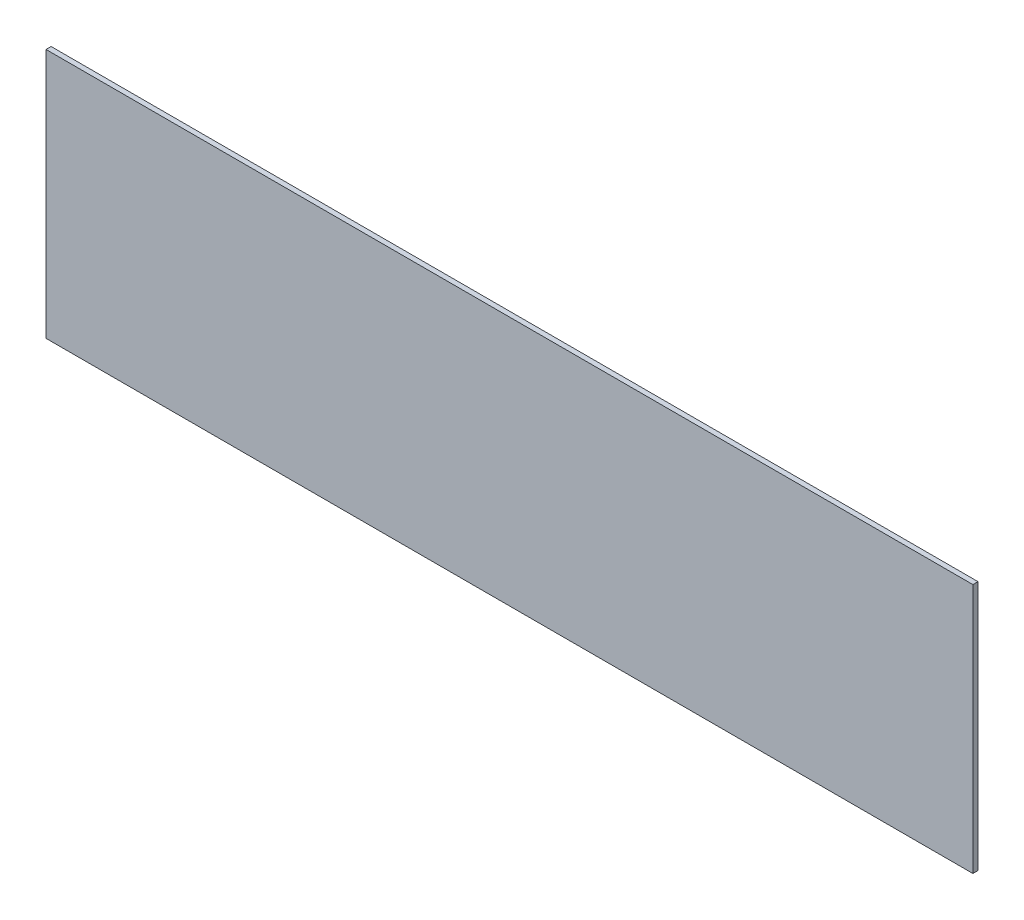
ISO-10303-21;
HEADER;
FILE_DESCRIPTION(('STEP AP214'),'2;1');
FILE_NAME('part.step','',(''),(''),'','','');
FILE_SCHEMA(('AUTOMOTIVE_DESIGN { 1 0 10303 214 1 1 1 1 }'));
ENDSEC;
DATA;
#1=APPLICATION_CONTEXT('core data for automotive mechanical design processes');
#2=APPLICATION_PROTOCOL_DEFINITION('international standard','automotive_design',2000,#1);
#3=PRODUCT_CONTEXT('',#1,'mechanical');
#4=PRODUCT('Part','Part','',(#3));
#5=PRODUCT_RELATED_PRODUCT_CATEGORY('part','',(#4));
#6=PRODUCT_DEFINITION_FORMATION('','',#4);
#7=PRODUCT_DEFINITION_CONTEXT('part definition',#1,'design');
#8=PRODUCT_DEFINITION('design','',#6,#7);
#9=PRODUCT_DEFINITION_SHAPE('','',#8);
#10=(LENGTH_UNIT() NAMED_UNIT(*) SI_UNIT(.MILLI.,.METRE.));
#11=(NAMED_UNIT(*) PLANE_ANGLE_UNIT() SI_UNIT($,.RADIAN.));
#12=(NAMED_UNIT(*) SI_UNIT($,.STERADIAN.) SOLID_ANGLE_UNIT());
#13=UNCERTAINTY_MEASURE_WITH_UNIT(LENGTH_MEASURE(1.E-05),#10,'distance_accuracy_value','');
#14=(GEOMETRIC_REPRESENTATION_CONTEXT(3) GLOBAL_UNCERTAINTY_ASSIGNED_CONTEXT((#13)) GLOBAL_UNIT_ASSIGNED_CONTEXT((#10,
#11,#12)) REPRESENTATION_CONTEXT('',''));
#15=CARTESIAN_POINT('',(0.,0.,0.));
#16=DIRECTION('',(0.,0.,1.));
#17=DIRECTION('',(1.,0.,0.));
#18=AXIS2_PLACEMENT_3D('',#15,#16,#17);
#19=CARTESIAN_POINT('',(181.51,0.,1.));
#20=DIRECTION('',(0.,1.,0.));
#21=DIRECTION('',(-1.,0.,0.));
#22=AXIS2_PLACEMENT_3D('',#19,#20,#21);
#23=PLANE('',#22);
#24=DIRECTION('',(1.,0.,0.));
#25=VECTOR('',#24,1.);
#26=CARTESIAN_POINT('',(181.51,0.,0.));
#27=LINE('',#26,#25);
#28=CARTESIAN_POINT('',(0.,0.,0.));
#29=VERTEX_POINT('',#28);
#30=CARTESIAN_POINT('',(181.51,0.,0.));
#31=VERTEX_POINT('',#30);
#32=EDGE_CURVE('E96',#29,#31,#27,.T.);
#33=ORIENTED_EDGE('',*,*,#32,.T.);
#34=DIRECTION('',(0.,0.,-1.));
#35=VECTOR('',#34,1.);
#36=CARTESIAN_POINT('',(181.51,0.,1.));
#37=LINE('',#36,#35);
#38=CARTESIAN_POINT('',(181.51,0.,1.));
#39=VERTEX_POINT('',#38);
#40=EDGE_CURVE('E11',#39,#31,#37,.T.);
#41=ORIENTED_EDGE('',*,*,#40,.F.);
#42=DIRECTION('',(1.,0.,0.));
#43=VECTOR('',#42,1.);
#44=CARTESIAN_POINT('',(181.51,0.,1.));
#45=LINE('',#44,#43);
#46=CARTESIAN_POINT('',(0.,0.,1.));
#47=VERTEX_POINT('',#46);
#48=EDGE_CURVE('E84',#47,#39,#45,.T.);
#49=ORIENTED_EDGE('',*,*,#48,.F.);
#50=DIRECTION('',(0.,0.,-1.));
#51=VECTOR('',#50,1.);
#52=CARTESIAN_POINT('',(0.,0.,1.));
#53=LINE('',#52,#51);
#54=EDGE_CURVE('E92',#47,#29,#53,.T.);
#55=ORIENTED_EDGE('',*,*,#54,.T.);
#56=EDGE_LOOP('',(#33,#41,#49,#55));
#57=FACE_BOUND('',#56,.T.);
#58=ADVANCED_FACE('F33',(#57),#23,.F.);
#59=CARTESIAN_POINT('',(181.51,49.,1.));
#60=DIRECTION('',(-1.,0.,0.));
#61=DIRECTION('',(0.,0.,1.));
#62=AXIS2_PLACEMENT_3D('',#59,#60,#61);
#63=PLANE('',#62);
#64=DIRECTION('',(0.,1.,0.));
#65=VECTOR('',#64,1.);
#66=CARTESIAN_POINT('',(181.51,49.,0.));
#67=LINE('',#66,#65);
#68=CARTESIAN_POINT('',(181.51,49.,0.));
#69=VERTEX_POINT('',#68);
#70=EDGE_CURVE('E88',#31,#69,#67,.T.);
#71=ORIENTED_EDGE('',*,*,#70,.T.);
#72=DIRECTION('',(0.,0.,-1.));
#73=VECTOR('',#72,1.);
#74=CARTESIAN_POINT('',(181.51,49.,1.));
#75=LINE('',#74,#73);
#76=CARTESIAN_POINT('',(181.51,49.,1.));
#77=VERTEX_POINT('',#76);
#78=EDGE_CURVE('E41',#77,#69,#75,.T.);
#79=ORIENTED_EDGE('',*,*,#78,.F.);
#80=DIRECTION('',(0.,1.,0.));
#81=VECTOR('',#80,1.);
#82=CARTESIAN_POINT('',(181.51,49.,1.));
#83=LINE('',#82,#81);
#84=EDGE_CURVE('E79',#39,#77,#83,.T.);
#85=ORIENTED_EDGE('',*,*,#84,.F.);
#86=ORIENTED_EDGE('',*,*,#40,.T.);
#87=EDGE_LOOP('',(#71,#79,#85,#86));
#88=FACE_BOUND('',#87,.T.);
#89=ADVANCED_FACE('F87',(#88),#63,.F.);
#90=CARTESIAN_POINT('',(0.,49.,1.));
#91=DIRECTION('',(0.,-1.,0.));
#92=DIRECTION('',(0.,0.,-1.));
#93=AXIS2_PLACEMENT_3D('',#90,#91,#92);
#94=PLANE('',#93);
#95=DIRECTION('',(-1.,0.,0.));
#96=VECTOR('',#95,1.);
#97=CARTESIAN_POINT('',(0.,49.,0.));
#98=LINE('',#97,#96);
#99=CARTESIAN_POINT('',(0.,49.,0.));
#100=VERTEX_POINT('',#99);
#101=EDGE_CURVE('E66',#69,#100,#98,.T.);
#102=ORIENTED_EDGE('',*,*,#101,.T.);
#103=DIRECTION('',(0.,0.,-1.));
#104=VECTOR('',#103,1.);
#105=CARTESIAN_POINT('',(0.,49.,1.));
#106=LINE('',#105,#104);
#107=CARTESIAN_POINT('',(0.,49.,1.));
#108=VERTEX_POINT('',#107);
#109=EDGE_CURVE('E89',#108,#100,#106,.T.);
#110=ORIENTED_EDGE('',*,*,#109,.F.);
#111=DIRECTION('',(-1.,0.,0.));
#112=VECTOR('',#111,1.);
#113=CARTESIAN_POINT('',(0.,49.,1.));
#114=LINE('',#113,#112);
#115=EDGE_CURVE('E82',#77,#108,#114,.T.);
#116=ORIENTED_EDGE('',*,*,#115,.F.);
#117=ORIENTED_EDGE('',*,*,#78,.T.);
#118=EDGE_LOOP('',(#102,#110,#116,#117));
#119=FACE_BOUND('',#118,.T.);
#120=ADVANCED_FACE('F90',(#119),#94,.F.);
#121=CARTESIAN_POINT('',(0.,0.,1.));
#122=DIRECTION('',(1.,0.,0.));
#123=DIRECTION('',(0.,0.,-1.));
#124=AXIS2_PLACEMENT_3D('',#121,#122,#123);
#125=PLANE('',#124);
#126=DIRECTION('',(0.,-1.,0.));
#127=VECTOR('',#126,1.);
#128=CARTESIAN_POINT('',(0.,0.,0.));
#129=LINE('',#128,#127);
#130=EDGE_CURVE('E72',#100,#29,#129,.T.);
#131=ORIENTED_EDGE('',*,*,#130,.T.);
#132=ORIENTED_EDGE('',*,*,#54,.F.);
#133=DIRECTION('',(0.,-1.,0.));
#134=VECTOR('',#133,1.);
#135=CARTESIAN_POINT('',(0.,0.,1.));
#136=LINE('',#135,#134);
#137=EDGE_CURVE('E49',#108,#47,#136,.T.);
#138=ORIENTED_EDGE('',*,*,#137,.F.);
#139=ORIENTED_EDGE('',*,*,#109,.T.);
#140=EDGE_LOOP('',(#131,#132,#138,#139));
#141=FACE_BOUND('',#140,.T.);
#142=ADVANCED_FACE('F103',(#141),#125,.F.);
#143=CARTESIAN_POINT('',(0.,0.,1.));
#144=DIRECTION('',(0.,0.,-1.));
#145=DIRECTION('',(-1.,0.,0.));
#146=AXIS2_PLACEMENT_3D('',#143,#144,#145);
#147=PLANE('',#146);
#148=ORIENTED_EDGE('',*,*,#48,.T.);
#149=ORIENTED_EDGE('',*,*,#84,.T.);
#150=ORIENTED_EDGE('',*,*,#115,.T.);
#151=ORIENTED_EDGE('',*,*,#137,.T.);
#152=EDGE_LOOP('',(#148,#149,#150,#151));
#153=FACE_BOUND('',#152,.T.);
#154=ADVANCED_FACE('F80',(#153),#147,.F.);
#155=CARTESIAN_POINT('',(0.,0.,0.));
#156=DIRECTION('',(0.,0.,-1.));
#157=DIRECTION('',(-1.,0.,0.));
#158=AXIS2_PLACEMENT_3D('',#155,#156,#157);
#159=PLANE('',#158);
#160=ORIENTED_EDGE('',*,*,#32,.F.);
#161=ORIENTED_EDGE('',*,*,#130,.F.);
#162=ORIENTED_EDGE('',*,*,#101,.F.);
#163=ORIENTED_EDGE('',*,*,#70,.F.);
#164=EDGE_LOOP('',(#160,#161,#162,#163));
#165=FACE_BOUND('',#164,.T.);
#166=ADVANCED_FACE('F106',(#165),#159,.T.);
#167=CLOSED_SHELL('',(#58,#89,#120,#142,#154,#166));
#168=MANIFOLD_SOLID_BREP('B2',#167);
#169=ADVANCED_BREP_SHAPE_REPRESENTATION('',(#18,#168),#14);
#170=SHAPE_DEFINITION_REPRESENTATION(#9,#169);
ENDSEC;
END-ISO-10303-21;
